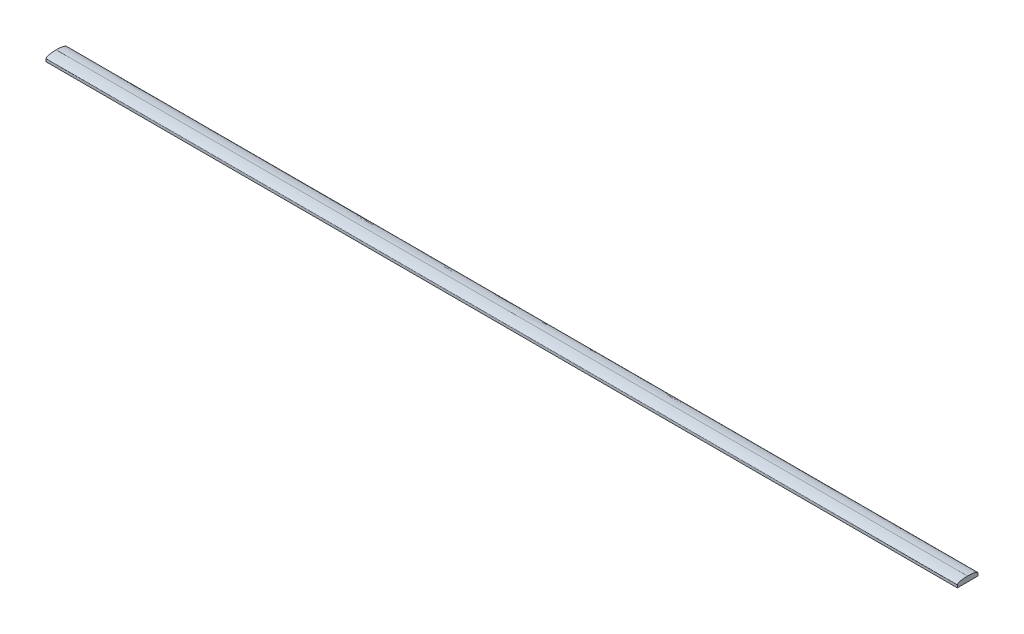
ISO-10303-21;
HEADER;
FILE_DESCRIPTION(('STEP AP214'),'2;1');
FILE_NAME('part.step','',(''),(''),'','','');
FILE_SCHEMA(('AUTOMOTIVE_DESIGN { 1 0 10303 214 1 1 1 1 }'));
ENDSEC;
DATA;
#1=APPLICATION_CONTEXT('core data for automotive mechanical design processes');
#2=APPLICATION_PROTOCOL_DEFINITION('international standard','automotive_design',2000,#1);
#3=PRODUCT_CONTEXT('',#1,'mechanical');
#4=PRODUCT('Part','Part','',(#3));
#5=PRODUCT_RELATED_PRODUCT_CATEGORY('part','',(#4));
#6=PRODUCT_DEFINITION_FORMATION('','',#4);
#7=PRODUCT_DEFINITION_CONTEXT('part definition',#1,'design');
#8=PRODUCT_DEFINITION('design','',#6,#7);
#9=PRODUCT_DEFINITION_SHAPE('','',#8);
#10=(LENGTH_UNIT() NAMED_UNIT(*) SI_UNIT(.MILLI.,.METRE.));
#11=(NAMED_UNIT(*) PLANE_ANGLE_UNIT() SI_UNIT($,.RADIAN.));
#12=(NAMED_UNIT(*) SI_UNIT($,.STERADIAN.) SOLID_ANGLE_UNIT());
#13=UNCERTAINTY_MEASURE_WITH_UNIT(LENGTH_MEASURE(1.E-05),#10,'distance_accuracy_value','');
#14=(GEOMETRIC_REPRESENTATION_CONTEXT(3) GLOBAL_UNCERTAINTY_ASSIGNED_CONTEXT((#13)) GLOBAL_UNIT_ASSIGNED_CONTEXT((#10,
#11,#12)) REPRESENTATION_CONTEXT('',''));
#15=CARTESIAN_POINT('',(0.,0.,0.));
#16=DIRECTION('',(0.,0.,1.));
#17=DIRECTION('',(1.,0.,0.));
#18=AXIS2_PLACEMENT_3D('',#15,#16,#17);
#19=CARTESIAN_POINT('',(0.,2.54,0.));
#20=DIRECTION('',(1.,0.,0.));
#21=DIRECTION('',(0.,0.,-1.));
#22=AXIS2_PLACEMENT_3D('',#19,#20,#21);
#23=PLANE('',#22);
#24=CARTESIAN_POINT('',(0.,1.27,-10.));
#25=CARTESIAN_POINT('',(0.,2.54,-10.));
#26=CARTESIAN_POINT('',(0.,2.54,-4.92));
#27=(BOUNDED_CURVE() B_SPLINE_CURVE(2,(#24,#25,#26),.UNSPECIFIED.,.F.,
.F.) B_SPLINE_CURVE_WITH_KNOTS((3,3),(0.,1.),
.UNSPECIFIED.) CURVE() GEOMETRIC_REPRESENTATION_ITEM() RATIONAL_B_SPLINE_CURVE((1.,
0.707106781186548,1.)) REPRESENTATION_ITEM(''));
#28=CARTESIAN_POINT('',(0.,2.53968508639551,-5.07996825173491));
#29=VERTEX_POINT('',#28);
#30=CARTESIAN_POINT('',(0.,2.54,-4.92000628963513));
#31=VERTEX_POINT('',#30);
#32=EDGE_CURVE('E127',#29,#31,#27,.T.);
#33=ORIENTED_EDGE('',*,*,#32,.F.);
#34=CARTESIAN_POINT('',(0.,1.27,-10.));
#35=CARTESIAN_POINT('',(0.,2.54,-10.));
#36=CARTESIAN_POINT('',(0.,2.54,-4.92));
#37=(BOUNDED_CURVE() B_SPLINE_CURVE(2,(#34,#35,#36),.UNSPECIFIED.,.F.,
.F.) B_SPLINE_CURVE_WITH_KNOTS((3,3),(0.,1.),
.UNSPECIFIED.) CURVE() GEOMETRIC_REPRESENTATION_ITEM() RATIONAL_B_SPLINE_CURVE((1.,
0.707106781186548,1.)) REPRESENTATION_ITEM(''));
#38=CARTESIAN_POINT('',(0.,1.27,-10.));
#39=VERTEX_POINT('',#38);
#40=EDGE_CURVE('E273',#29,#39,#37,.F.);
#41=ORIENTED_EDGE('',*,*,#40,.T.);
#42=DIRECTION('',(0.,-1.,0.));
#43=VECTOR('',#42,1.);
#44=CARTESIAN_POINT('',(0.,2.54,-10.));
#45=LINE('',#44,#43);
#46=CARTESIAN_POINT('',(0.,0.,-10.));
#47=VERTEX_POINT('',#46);
#48=EDGE_CURVE('E280',#39,#47,#45,.T.);
#49=ORIENTED_EDGE('',*,*,#48,.T.);
#50=DIRECTION('',(0.,0.,1.));
#51=VECTOR('',#50,1.);
#52=CARTESIAN_POINT('',(0.,0.,0.));
#53=LINE('',#52,#51);
#54=CARTESIAN_POINT('',(0.,0.,0.));
#55=VERTEX_POINT('',#54);
#56=EDGE_CURVE('E122',#47,#55,#53,.T.);
#57=ORIENTED_EDGE('',*,*,#56,.T.);
#58=DIRECTION('',(0.,-1.,0.));
#59=VECTOR('',#58,1.);
#60=CARTESIAN_POINT('',(0.,2.54,0.));
#61=LINE('',#60,#59);
#62=CARTESIAN_POINT('',(0.,1.27,0.));
#63=VERTEX_POINT('',#62);
#64=EDGE_CURVE('E103',#63,#55,#61,.T.);
#65=ORIENTED_EDGE('',*,*,#64,.F.);
#66=CARTESIAN_POINT('',(0.,2.54,-5.08));
#67=CARTESIAN_POINT('',(0.,2.54,0.));
#68=CARTESIAN_POINT('',(0.,1.27,0.));
#69=(BOUNDED_CURVE() B_SPLINE_CURVE(2,(#66,#67,#68),.UNSPECIFIED.,.F.,
.F.) B_SPLINE_CURVE_WITH_KNOTS((3,3),(0.,1.),
.UNSPECIFIED.) CURVE() GEOMETRIC_REPRESENTATION_ITEM() RATIONAL_B_SPLINE_CURVE((1.,
0.707106781186548,1.)) REPRESENTATION_ITEM(''));
#70=EDGE_CURVE('E197',#63,#31,#69,.F.);
#71=ORIENTED_EDGE('',*,*,#70,.T.);
#72=EDGE_LOOP('',(#33,#41,#49,#57,#65,#71));
#73=FACE_BOUND('',#72,.T.);
#74=ADVANCED_FACE('F44',(#73),#23,.F.);
#75=CARTESIAN_POINT('',(0.,2.54,0.));
#76=DIRECTION('',(0.,0.,-1.));
#77=DIRECTION('',(-1.,0.,0.));
#78=AXIS2_PLACEMENT_3D('',#75,#76,#77);
#79=PLANE('',#78);
#80=DIRECTION('',(0.,-1.,0.));
#81=VECTOR('',#80,1.);
#82=CARTESIAN_POINT('',(441.198,2.54,0.));
#83=LINE('',#82,#81);
#84=CARTESIAN_POINT('',(441.198,1.27,0.));
#85=VERTEX_POINT('',#84);
#86=CARTESIAN_POINT('',(441.198,0.,0.));
#87=VERTEX_POINT('',#86);
#88=EDGE_CURVE('E264',#85,#87,#83,.T.);
#89=ORIENTED_EDGE('',*,*,#88,.F.);
#90=CARTESIAN_POINT('',(-22.0599,1.27,0.));
#91=CARTESIAN_POINT('',(139.7127,1.27,0.));
#92=CARTESIAN_POINT('',(301.4853,1.27,0.));
#93=CARTESIAN_POINT('',(463.2579,1.27,0.));
#94=(BOUNDED_CURVE() B_SPLINE_CURVE(3,(#90,#91,#92,#93),.UNSPECIFIED.,.F.,
.F.) B_SPLINE_CURVE_WITH_KNOTS((4,4),(-0.0220599,0.4632579),
.UNSPECIFIED.) CURVE() GEOMETRIC_REPRESENTATION_ITEM() RATIONAL_B_SPLINE_CURVE((1.,1.,1.,1.)) REPRESENTATION_ITEM(''));
#95=EDGE_CURVE('E12',#85,#63,#94,.F.);
#96=ORIENTED_EDGE('',*,*,#95,.T.);
#97=ORIENTED_EDGE('',*,*,#64,.T.);
#98=DIRECTION('',(1.,0.,0.));
#99=VECTOR('',#98,1.);
#100=CARTESIAN_POINT('',(0.,0.,0.));
#101=LINE('',#100,#99);
#102=EDGE_CURVE('E317',#55,#87,#101,.T.);
#103=ORIENTED_EDGE('',*,*,#102,.T.);
#104=EDGE_LOOP('',(#89,#96,#97,#103));
#105=FACE_BOUND('',#104,.T.);
#106=ADVANCED_FACE('F238',(#105),#79,.F.);
#107=CARTESIAN_POINT('',(441.198,2.54,0.));
#108=DIRECTION('',(-1.,0.,0.));
#109=DIRECTION('',(0.,0.,1.));
#110=AXIS2_PLACEMENT_3D('',#107,#108,#109);
#111=PLANE('',#110);
#112=DIRECTION('',(0.,-1.,0.));
#113=VECTOR('',#112,1.);
#114=CARTESIAN_POINT('',(441.198,2.54,-10.));
#115=LINE('',#114,#113);
#116=CARTESIAN_POINT('',(441.198,1.27,-10.));
#117=VERTEX_POINT('',#116);
#118=CARTESIAN_POINT('',(441.198,0.,-10.));
#119=VERTEX_POINT('',#118);
#120=EDGE_CURVE('E274',#117,#119,#115,.T.);
#121=ORIENTED_EDGE('',*,*,#120,.F.);
#122=CARTESIAN_POINT('',(441.198,2.54,-4.92));
#123=CARTESIAN_POINT('',(441.198,2.54,-10.));
#124=CARTESIAN_POINT('',(441.198,1.27,-10.));
#125=(BOUNDED_CURVE() B_SPLINE_CURVE(2,(#122,#123,#124),.UNSPECIFIED.,.F.,
.F.) B_SPLINE_CURVE_WITH_KNOTS((3,3),(0.,1.),
.UNSPECIFIED.) CURVE() GEOMETRIC_REPRESENTATION_ITEM() RATIONAL_B_SPLINE_CURVE((1.,
0.707106781186548,1.)) REPRESENTATION_ITEM(''));
#126=CARTESIAN_POINT('',(441.198,2.53968501105831,-5.07998738390612));
#127=VERTEX_POINT('',#126);
#128=EDGE_CURVE('E61',#117,#127,#125,.F.);
#129=ORIENTED_EDGE('',*,*,#128,.T.);
#130=CARTESIAN_POINT('',(441.198,2.54,-4.92));
#131=CARTESIAN_POINT('',(441.198,2.54,-10.));
#132=CARTESIAN_POINT('',(441.198,1.27,-10.));
#133=(BOUNDED_CURVE() B_SPLINE_CURVE(2,(#130,#131,#132),.UNSPECIFIED.,.F.,
.F.) B_SPLINE_CURVE_WITH_KNOTS((3,3),(0.,1.),
.UNSPECIFIED.) CURVE() GEOMETRIC_REPRESENTATION_ITEM() RATIONAL_B_SPLINE_CURVE((1.,
0.707106781186547,1.)) REPRESENTATION_ITEM(''));
#134=CARTESIAN_POINT('',(441.197990063129,2.54,-4.9200000035921));
#135=VERTEX_POINT('',#134);
#136=EDGE_CURVE('E224',#135,#127,#133,.T.);
#137=ORIENTED_EDGE('',*,*,#136,.F.);
#138=CARTESIAN_POINT('',(441.198,1.27,0.));
#139=CARTESIAN_POINT('',(441.198,2.54,0.));
#140=CARTESIAN_POINT('',(441.198,2.54,-5.08));
#141=(BOUNDED_CURVE() B_SPLINE_CURVE(2,(#138,#139,#140),.UNSPECIFIED.,.F.,
.F.) B_SPLINE_CURVE_WITH_KNOTS((3,3),(0.,1.),
.UNSPECIFIED.) CURVE() GEOMETRIC_REPRESENTATION_ITEM() RATIONAL_B_SPLINE_CURVE((1.,
0.707106781186548,1.)) REPRESENTATION_ITEM(''));
#142=EDGE_CURVE('E68',#135,#85,#141,.F.);
#143=ORIENTED_EDGE('',*,*,#142,.T.);
#144=ORIENTED_EDGE('',*,*,#88,.T.);
#145=DIRECTION('',(0.,0.,-1.));
#146=VECTOR('',#145,1.);
#147=CARTESIAN_POINT('',(441.198,0.,0.));
#148=LINE('',#147,#146);
#149=EDGE_CURVE('E313',#87,#119,#148,.T.);
#150=ORIENTED_EDGE('',*,*,#149,.T.);
#151=EDGE_LOOP('',(#121,#129,#137,#143,#144,#150));
#152=FACE_BOUND('',#151,.T.);
#153=ADVANCED_FACE('F228',(#152),#111,.F.);
#154=CARTESIAN_POINT('',(0.,2.54,-10.));
#155=DIRECTION('',(0.,0.,1.));
#156=DIRECTION('',(1.,0.,0.));
#157=AXIS2_PLACEMENT_3D('',#154,#155,#156);
#158=PLANE('',#157);
#159=ORIENTED_EDGE('',*,*,#48,.F.);
#160=CARTESIAN_POINT('',(463.2579,1.27,-10.));
#161=CARTESIAN_POINT('',(301.4853,1.27,-10.));
#162=CARTESIAN_POINT('',(139.7127,1.27,-10.));
#163=CARTESIAN_POINT('',(-22.0599000000001,1.27,-10.));
#164=(BOUNDED_CURVE() B_SPLINE_CURVE(3,(#160,#161,#162,#163),.UNSPECIFIED.,.F.,
.F.) B_SPLINE_CURVE_WITH_KNOTS((4,4),(-0.4632579,0.0220599),
.UNSPECIFIED.) CURVE() GEOMETRIC_REPRESENTATION_ITEM() RATIONAL_B_SPLINE_CURVE((1.,1.,1.,1.)) REPRESENTATION_ITEM(''));
#165=EDGE_CURVE('E187',#39,#117,#164,.F.);
#166=ORIENTED_EDGE('',*,*,#165,.T.);
#167=ORIENTED_EDGE('',*,*,#120,.T.);
#168=DIRECTION('',(-1.,0.,0.));
#169=VECTOR('',#168,1.);
#170=CARTESIAN_POINT('',(0.,0.,-10.));
#171=LINE('',#170,#169);
#172=EDGE_CURVE('E287',#119,#47,#171,.T.);
#173=ORIENTED_EDGE('',*,*,#172,.T.);
#174=EDGE_LOOP('',(#159,#166,#167,#173));
#175=FACE_BOUND('',#174,.T.);
#176=ADVANCED_FACE('F237',(#175),#158,.F.);
#177=CARTESIAN_POINT('',(0.,0.,0.));
#178=DIRECTION('',(0.,-1.,0.));
#179=DIRECTION('',(0.,0.,-1.));
#180=AXIS2_PLACEMENT_3D('',#177,#178,#179);
#181=PLANE('',#180);
#182=ORIENTED_EDGE('',*,*,#56,.F.);
#183=ORIENTED_EDGE('',*,*,#172,.F.);
#184=ORIENTED_EDGE('',*,*,#149,.F.);
#185=ORIENTED_EDGE('',*,*,#102,.F.);
#186=EDGE_LOOP('',(#182,#183,#184,#185));
#187=FACE_BOUND('',#186,.T.);
#188=ADVANCED_FACE('F318',(#187),#181,.T.);
#189=CARTESIAN_POINT('',(-22.0599,2.54,-5.08));
#190=CARTESIAN_POINT('',(139.7127,2.54,-5.08));
#191=CARTESIAN_POINT('',(301.4853,2.54,-5.08));
#192=CARTESIAN_POINT('',(463.2579,2.54,-5.08));
#193=CARTESIAN_POINT('',(-22.0599,2.54,0.));
#194=CARTESIAN_POINT('',(139.7127,2.54,0.));
#195=CARTESIAN_POINT('',(301.4853,2.54,0.));
#196=CARTESIAN_POINT('',(463.2579,2.54,0.));
#197=CARTESIAN_POINT('',(-22.0599,1.27,0.));
#198=CARTESIAN_POINT('',(139.7127,1.27,0.));
#199=CARTESIAN_POINT('',(301.4853,1.27,0.));
#200=CARTESIAN_POINT('',(463.2579,1.27,0.));
#201=(BOUNDED_SURFACE() B_SPLINE_SURFACE(2,3,((#189,#190,#191,#192),(#193,#194,#195,#196),(#197,
#198,#199,#200)),.UNSPECIFIED.,.F.,.F.,.F.) B_SPLINE_SURFACE_WITH_KNOTS((3,3),(4,4),(0.,1.),
(-0.0220599,0.4632579),
.UNSPECIFIED.) GEOMETRIC_REPRESENTATION_ITEM() RATIONAL_B_SPLINE_SURFACE(((1.,1.,1.,1.),
(0.707106781186548,0.707106781186548,0.707106781186548,0.707106781186548),(1.,1.,1.,1.))) REPRESENTATION_ITEM('') SURFACE());
#202=CARTESIAN_POINT('',(220.599,2.53984250992003,-5.00000000000006));
#203=CARTESIAN_POINT('',(229.790624585494,2.53985567608562,-4.99665620908857));
#204=CARTESIAN_POINT('',(238.982249171457,2.53986801151515,-4.99331370351936));
#205=CARTESIAN_POINT('',(257.365498343383,2.53989102481231,-4.98663127955559));
#206=CARTESIAN_POINT('',(266.557122929346,2.53990170267994,-4.98329136116103));
#207=CARTESIAN_POINT('',(284.940372101272,2.53992140476353,-4.9766141280363));
#208=CARTESIAN_POINT('',(294.131996687235,2.53993042897948,-4.97327681330613));
#209=CARTESIAN_POINT('',(312.51524585916,2.53994682768257,-4.96660480388802));
#210=CARTESIAN_POINT('',(321.706870445123,2.5399542021697,-4.96327010920008));
#211=CARTESIAN_POINT('',(340.090119617049,2.53996730534696,-4.95660335616283));
#212=CARTESIAN_POINT('',(349.281744203012,2.5399730340371,-4.95327129781352));
#213=CARTESIAN_POINT('',(367.664993374938,2.53998284956224,-4.94660983365837));
#214=CARTESIAN_POINT('',(376.856617960901,2.53998693639724,-4.94328042785253));
#215=CARTESIAN_POINT('',(395.239867132827,2.53999347216278,-4.93662428490769));
#216=CARTESIAN_POINT('',(404.43149171879,2.53999592109331,-4.93329754776869));
#217=CARTESIAN_POINT('',(422.814740890715,2.53999918501246,-4.92664675816895));
#218=CARTESIAN_POINT('',(432.006365476678,2.54000000000107,-4.9233227057082));
#219=CARTESIAN_POINT('',(441.197990063129,2.54,-4.9200000035921));
#220=B_SPLINE_CURVE_WITH_KNOTS('',3,(#202,#203,#204,#205,#206,#207,#208,#209,#210,#211,#212,
#213,#214,#215,#216,#217,#218,#219),.UNSPECIFIED.,.F.,.F.,(4,2,2,2,2,2,2,2,4),(0.,
27.5748755811505,55.1497511594735,82.7246267349541,110.299502307577,137.874377877329,
165.449253444194,193.024129008159,220.599004569209),.UNSPECIFIED.);
#221=CARTESIAN_POINT('',(220.599,2.53984250992003,-5.00000000000006));
#222=VERTEX_POINT('',#221);
#223=EDGE_CURVE('E109',#222,#135,#220,.T.);
#224=CARTESIAN_POINT('',(0.,2.54,-4.92));
#225=CARTESIAN_POINT('',(9.19162500048743,2.54000000000166,-4.92332270226479));
#226=CARTESIAN_POINT('',(18.3832500004866,2.53999918501356,-4.92664675487436));
#227=CARTESIAN_POINT('',(36.766500000485,2.5399959210953,-4.933297544772));
#228=CARTESIAN_POINT('',(45.9581250004842,2.53999347216513,-4.93662428206007));
#229=CARTESIAN_POINT('',(64.3413750004827,2.53998693640018,-4.94328042530329));
#230=CARTESIAN_POINT('',(73.5330000004819,2.5399828495654,-4.94660983125845));
#231=CARTESIAN_POINT('',(91.9162500004803,2.53997303404056,-4.95327129571247));
#232=CARTESIAN_POINT('',(101.107875000479,2.5399673053505,-4.95660335421133));
#233=CARTESIAN_POINT('',(119.491125000478,2.53995420217324,-4.96327010754793));
#234=CARTESIAN_POINT('',(128.682750000477,2.53994682768604,-4.96660480238567));
#235=CARTESIAN_POINT('',(147.066000000475,2.53993042898266,-4.97327681210362));
#236=CARTESIAN_POINT('',(156.257625000475,2.53992140476648,-4.97661412698382));
#237=CARTESIAN_POINT('',(174.640875000473,2.53990170268231,-4.98329136040886));
#238=CARTESIAN_POINT('',(183.832500000472,2.53989102481431,-4.98663127895369));
#239=CARTESIAN_POINT('',(202.21575000047,2.53986801151627,-4.99331370321823));
#240=CARTESIAN_POINT('',(211.40737500047,2.53985567608622,-4.99665620893795));
#241=CARTESIAN_POINT('',(220.599,2.53984250992003,-5.00000000000006));
#242=B_SPLINE_CURVE_WITH_KNOTS('',3,(#224,#225,#226,#227,#228,#229,#230,#231,#232,#233,#234,
#235,#236,#237,#238,#239,#240,#241),.UNSPECIFIED.,.F.,.F.,(4,2,2,2,2,2,2,2,4),(0.,
27.5748768031591,55.1497536092329,82.7246304182073,110.299507230068,137.8743840448,
165.44926086239,193.024137682821,220.599014506081),.UNSPECIFIED.);
#243=EDGE_CURVE('E114',#31,#222,#242,.T.);
#244=ORIENTED_EDGE('',*,*,#95,.F.);
#245=ORIENTED_EDGE('',*,*,#142,.F.);
#246=ORIENTED_EDGE('',*,*,#223,.F.);
#247=ORIENTED_EDGE('',*,*,#243,.F.);
#248=ORIENTED_EDGE('',*,*,#70,.F.);
#249=EDGE_LOOP('',(#244,#245,#246,#247,#248));
#250=FACE_BOUND('',#249,.T.);
#251=ADVANCED_FACE('F47',(#250),#201,.T.);
#252=CARTESIAN_POINT('',(463.2579,2.54,-4.92));
#253=CARTESIAN_POINT('',(301.4853,2.54,-4.92));
#254=CARTESIAN_POINT('',(139.7127,2.54,-4.92));
#255=CARTESIAN_POINT('',(-22.0599000000001,2.54,-4.92));
#256=CARTESIAN_POINT('',(463.2579,2.54,-10.));
#257=CARTESIAN_POINT('',(301.4853,2.54,-10.));
#258=CARTESIAN_POINT('',(139.7127,2.54,-10.));
#259=CARTESIAN_POINT('',(-22.0599000000001,2.54,-10.));
#260=CARTESIAN_POINT('',(463.2579,1.27,-10.));
#261=CARTESIAN_POINT('',(301.4853,1.27,-10.));
#262=CARTESIAN_POINT('',(139.7127,1.27,-10.));
#263=CARTESIAN_POINT('',(-22.0599000000001,1.27,-10.));
#264=(BOUNDED_SURFACE() B_SPLINE_SURFACE(2,3,((#252,#253,#254,#255),(#256,#257,#258,#259),(#260,
#261,#262,#263)),.UNSPECIFIED.,.F.,.F.,.F.) B_SPLINE_SURFACE_WITH_KNOTS((3,3),(4,4),(0.,1.),
(-0.4632579,0.0220599),
.UNSPECIFIED.) GEOMETRIC_REPRESENTATION_ITEM() RATIONAL_B_SPLINE_SURFACE(((1.,1.,1.,1.),
(0.707106781186548,0.707106781186548,0.707106781186548,0.707106781186548),(1.,1.,1.,1.))) REPRESENTATION_ITEM('') SURFACE());
#265=ORIENTED_EDGE('',*,*,#128,.F.);
#266=ORIENTED_EDGE('',*,*,#165,.F.);
#267=ORIENTED_EDGE('',*,*,#40,.F.);
#268=ORIENTED_EDGE('',*,*,#32,.T.);
#269=ORIENTED_EDGE('',*,*,#243,.T.);
#270=ORIENTED_EDGE('',*,*,#223,.T.);
#271=ORIENTED_EDGE('',*,*,#136,.T.);
#272=EDGE_LOOP('',(#265,#266,#267,#268,#269,#270,#271));
#273=FACE_BOUND('',#272,.T.);
#274=ADVANCED_FACE('F125',(#273),#264,.T.);
#275=CLOSED_SHELL('',(#74,#106,#153,#176,#188,#251,#274));
#276=MANIFOLD_SOLID_BREP('B2',#275);
#277=ADVANCED_BREP_SHAPE_REPRESENTATION('',(#18,#276),#14);
#278=SHAPE_DEFINITION_REPRESENTATION(#9,#277);
ENDSEC;
END-ISO-10303-21;
